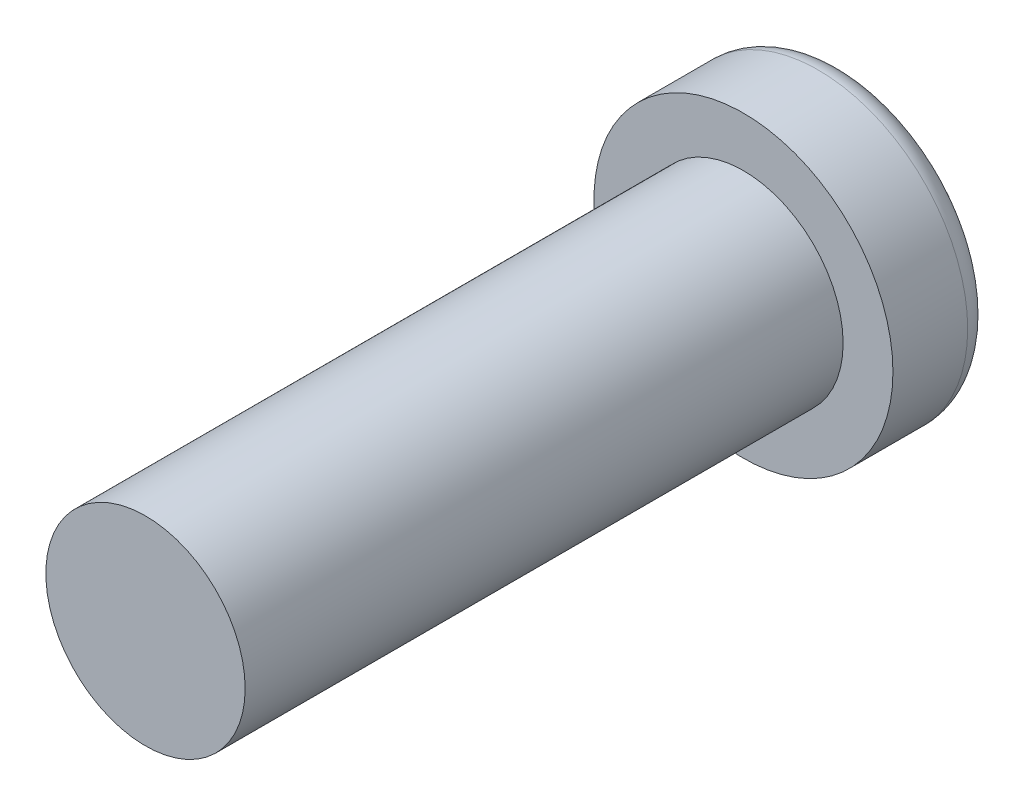
ISO-10303-21;
HEADER;
FILE_DESCRIPTION(('STEP AP214'),'2;1');
FILE_NAME('part.step','',(''),(''),'','','');
FILE_SCHEMA(('AUTOMOTIVE_DESIGN { 1 0 10303 214 1 1 1 1 }'));
ENDSEC;
DATA;
#1=APPLICATION_CONTEXT('core data for automotive mechanical design processes');
#2=APPLICATION_PROTOCOL_DEFINITION('international standard','automotive_design',2000,#1);
#3=PRODUCT_CONTEXT('',#1,'mechanical');
#4=PRODUCT('Part','Part','',(#3));
#5=PRODUCT_RELATED_PRODUCT_CATEGORY('part','',(#4));
#6=PRODUCT_DEFINITION_FORMATION('','',#4);
#7=PRODUCT_DEFINITION_CONTEXT('part definition',#1,'design');
#8=PRODUCT_DEFINITION('design','',#6,#7);
#9=PRODUCT_DEFINITION_SHAPE('','',#8);
#10=(LENGTH_UNIT() NAMED_UNIT(*) SI_UNIT(.MILLI.,.METRE.));
#11=(NAMED_UNIT(*) PLANE_ANGLE_UNIT() SI_UNIT($,.RADIAN.));
#12=(NAMED_UNIT(*) SI_UNIT($,.STERADIAN.) SOLID_ANGLE_UNIT());
#13=UNCERTAINTY_MEASURE_WITH_UNIT(LENGTH_MEASURE(1.E-05),#10,'distance_accuracy_value','');
#14=(GEOMETRIC_REPRESENTATION_CONTEXT(3) GLOBAL_UNCERTAINTY_ASSIGNED_CONTEXT((#13)) GLOBAL_UNIT_ASSIGNED_CONTEXT((#10,
#11,#12)) REPRESENTATION_CONTEXT('',''));
#15=CARTESIAN_POINT('',(0.,0.,0.));
#16=DIRECTION('',(0.,0.,1.));
#17=DIRECTION('',(1.,0.,0.));
#18=AXIS2_PLACEMENT_3D('',#15,#16,#17);
#19=CARTESIAN_POINT('',(0.,0.,2.));
#20=DIRECTION('',(0.,0.,-1.));
#21=DIRECTION('',(-1.,0.,0.));
#22=AXIS2_PLACEMENT_3D('',#19,#20,#21);
#23=CYLINDRICAL_SURFACE('',#22,3.);
#24=CARTESIAN_POINT('',(0.,0.,0.5));
#25=DIRECTION('',(0.,0.,1.));
#26=DIRECTION('',(1.,0.,0.));
#27=AXIS2_PLACEMENT_3D('',#24,#25,#26);
#28=CIRCLE('',#27,3.);
#29=CARTESIAN_POINT('',(3.,0.,0.5));
#30=VERTEX_POINT('',#29);
#31=EDGE_CURVE('E51',#30,#30,#28,.T.);
#32=ORIENTED_EDGE('',*,*,#31,.T.);
#33=EDGE_LOOP('',(#32));
#34=FACE_BOUND('',#33,.T.);
#35=CARTESIAN_POINT('',(0.,0.,2.));
#36=DIRECTION('',(0.,0.,1.));
#37=DIRECTION('',(1.,0.,0.));
#38=AXIS2_PLACEMENT_3D('',#35,#36,#37);
#39=CIRCLE('',#38,3.);
#40=CARTESIAN_POINT('',(3.,0.,2.));
#41=VERTEX_POINT('',#40);
#42=EDGE_CURVE('E61',#41,#41,#39,.T.);
#43=ORIENTED_EDGE('',*,*,#42,.F.);
#44=EDGE_LOOP('',(#43));
#45=FACE_BOUND('',#44,.T.);
#46=ADVANCED_FACE('F43',(#34,#45),#23,.T.);
#47=CARTESIAN_POINT('',(0.,0.,2.));
#48=DIRECTION('',(0.,0.,1.));
#49=DIRECTION('',(1.,0.,0.));
#50=AXIS2_PLACEMENT_3D('',#47,#48,#49);
#51=PLANE('',#50);
#52=CARTESIAN_POINT('',(0.,0.,2.));
#53=DIRECTION('',(0.,0.,1.));
#54=DIRECTION('',(1.,0.,0.));
#55=AXIS2_PLACEMENT_3D('',#52,#53,#54);
#56=CIRCLE('',#55,2.);
#57=CARTESIAN_POINT('',(2.,0.,2.));
#58=VERTEX_POINT('',#57);
#59=EDGE_CURVE('E56',#58,#58,#56,.T.);
#60=ORIENTED_EDGE('',*,*,#59,.F.);
#61=EDGE_LOOP('',(#60));
#62=FACE_BOUND('',#61,.T.);
#63=ORIENTED_EDGE('',*,*,#42,.T.);
#64=EDGE_LOOP('',(#63));
#65=FACE_BOUND('',#64,.T.);
#66=ADVANCED_FACE('F81',(#62,#65),#51,.T.);
#67=CARTESIAN_POINT('',(0.,0.,0.));
#68=DIRECTION('',(0.,0.,1.));
#69=DIRECTION('',(1.,0.,0.));
#70=AXIS2_PLACEMENT_3D('',#67,#68,#69);
#71=PLANE('',#70);
#72=CARTESIAN_POINT('',(0.,0.,0.));
#73=DIRECTION('',(0.,0.,1.));
#74=DIRECTION('',(1.,0.,0.));
#75=AXIS2_PLACEMENT_3D('',#72,#73,#74);
#76=CIRCLE('',#75,2.5);
#77=CARTESIAN_POINT('',(2.5,0.,0.));
#78=VERTEX_POINT('',#77);
#79=EDGE_CURVE('E10',#78,#78,#76,.F.);
#80=ORIENTED_EDGE('',*,*,#79,.T.);
#81=EDGE_LOOP('',(#80));
#82=FACE_BOUND('',#81,.T.);
#83=ADVANCED_FACE('F77',(#82),#71,.F.);
#84=CARTESIAN_POINT('',(0.,0.,14.));
#85=DIRECTION('',(0.,0.,-1.));
#86=DIRECTION('',(-1.,0.,0.));
#87=AXIS2_PLACEMENT_3D('',#84,#85,#86);
#88=CYLINDRICAL_SURFACE('',#87,2.);
#89=CARTESIAN_POINT('',(0.,0.,14.));
#90=DIRECTION('',(0.,0.,1.));
#91=DIRECTION('',(1.,0.,0.));
#92=AXIS2_PLACEMENT_3D('',#89,#90,#91);
#93=CIRCLE('',#92,2.);
#94=CARTESIAN_POINT('',(2.,0.,14.));
#95=VERTEX_POINT('',#94);
#96=EDGE_CURVE('E66',#95,#95,#93,.T.);
#97=ORIENTED_EDGE('',*,*,#96,.F.);
#98=EDGE_LOOP('',(#97));
#99=FACE_BOUND('',#98,.T.);
#100=ORIENTED_EDGE('',*,*,#59,.T.);
#101=EDGE_LOOP('',(#100));
#102=FACE_BOUND('',#101,.T.);
#103=ADVANCED_FACE('F74',(#99,#102),#88,.T.);
#104=CARTESIAN_POINT('',(0.,0.,14.));
#105=DIRECTION('',(0.,0.,1.));
#106=DIRECTION('',(1.,0.,0.));
#107=AXIS2_PLACEMENT_3D('',#104,#105,#106);
#108=PLANE('',#107);
#109=ORIENTED_EDGE('',*,*,#96,.T.);
#110=EDGE_LOOP('',(#109));
#111=FACE_BOUND('',#110,.T.);
#112=ADVANCED_FACE('F72',(#111),#108,.T.);
#113=CARTESIAN_POINT('',(0.,0.,0.5));
#114=DIRECTION('',(0.,0.,1.));
#115=DIRECTION('',(1.,0.,0.));
#116=AXIS2_PLACEMENT_3D('',#113,#114,#115);
#117=TOROIDAL_SURFACE('',#116,2.5,0.5);
#118=ORIENTED_EDGE('',*,*,#79,.F.);
#119=EDGE_LOOP('',(#118));
#120=FACE_BOUND('',#119,.T.);
#121=ORIENTED_EDGE('',*,*,#31,.F.);
#122=EDGE_LOOP('',(#121));
#123=FACE_BOUND('',#122,.T.);
#124=ADVANCED_FACE('F45',(#120,#123),#117,.T.);
#125=CLOSED_SHELL('',(#46,#66,#83,#103,#112,#124));
#126=MANIFOLD_SOLID_BREP('B2',#125);
#127=ADVANCED_BREP_SHAPE_REPRESENTATION('',(#18,#126),#14);
#128=SHAPE_DEFINITION_REPRESENTATION(#9,#127);
ENDSEC;
END-ISO-10303-21;
